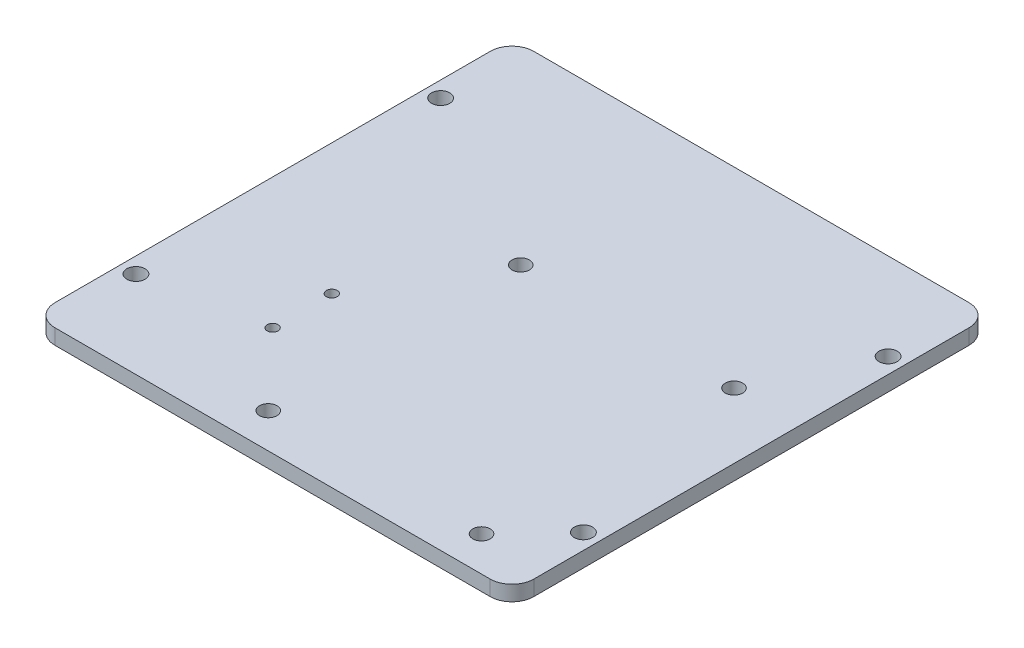
ISO-10303-21;
HEADER;
FILE_DESCRIPTION(('STEP AP214'),'2;1');
FILE_NAME('part.step','',(''),(''),'','','');
FILE_SCHEMA(('AUTOMOTIVE_DESIGN { 1 0 10303 214 1 1 1 1 }'));
ENDSEC;
DATA;
#1=APPLICATION_CONTEXT('core data for automotive mechanical design processes');
#2=APPLICATION_PROTOCOL_DEFINITION('international standard','automotive_design',2000,#1);
#3=PRODUCT_CONTEXT('',#1,'mechanical');
#4=PRODUCT('Part','Part','',(#3));
#5=PRODUCT_RELATED_PRODUCT_CATEGORY('part','',(#4));
#6=PRODUCT_DEFINITION_FORMATION('','',#4);
#7=PRODUCT_DEFINITION_CONTEXT('part definition',#1,'design');
#8=PRODUCT_DEFINITION('design','',#6,#7);
#9=PRODUCT_DEFINITION_SHAPE('','',#8);
#10=(LENGTH_UNIT() NAMED_UNIT(*) SI_UNIT(.MILLI.,.METRE.));
#11=(NAMED_UNIT(*) PLANE_ANGLE_UNIT() SI_UNIT($,.RADIAN.));
#12=(NAMED_UNIT(*) SI_UNIT($,.STERADIAN.) SOLID_ANGLE_UNIT());
#13=UNCERTAINTY_MEASURE_WITH_UNIT(LENGTH_MEASURE(1.E-05),#10,'distance_accuracy_value','');
#14=(GEOMETRIC_REPRESENTATION_CONTEXT(3) GLOBAL_UNCERTAINTY_ASSIGNED_CONTEXT((#13)) GLOBAL_UNIT_ASSIGNED_CONTEXT((#10,
#11,#12)) REPRESENTATION_CONTEXT('',''));
#15=CARTESIAN_POINT('',(0.,0.,0.));
#16=DIRECTION('',(0.,0.,1.));
#17=DIRECTION('',(1.,0.,0.));
#18=AXIS2_PLACEMENT_3D('',#15,#16,#17);
#19=CARTESIAN_POINT('',(0.,3.5,-55.));
#20=DIRECTION('',(0.,0.,-1.));
#21=DIRECTION('',(-1.,0.,0.));
#22=AXIS2_PLACEMENT_3D('',#19,#20,#21);
#23=PLANE('',#22);
#24=DIRECTION('',(1.,0.,0.));
#25=VECTOR('',#24,1.);
#26=CARTESIAN_POINT('',(0.,0.,-55.));
#27=LINE('',#26,#25);
#28=CARTESIAN_POINT('',(-50.,0.,-55.));
#29=VERTEX_POINT('',#28);
#30=CARTESIAN_POINT('',(50.,0.,-55.));
#31=VERTEX_POINT('',#30);
#32=EDGE_CURVE('E131',#29,#31,#27,.T.);
#33=ORIENTED_EDGE('',*,*,#32,.F.);
#34=DIRECTION('',(0.,-1.,0.));
#35=VECTOR('',#34,1.);
#36=CARTESIAN_POINT('',(-50.,3.5,-55.));
#37=LINE('',#36,#35);
#38=CARTESIAN_POINT('',(-50.,3.5,-55.));
#39=VERTEX_POINT('',#38);
#40=EDGE_CURVE('E153',#29,#39,#37,.F.);
#41=ORIENTED_EDGE('',*,*,#40,.T.);
#42=DIRECTION('',(1.,0.,0.));
#43=VECTOR('',#42,1.);
#44=CARTESIAN_POINT('',(0.,3.5,-55.));
#45=LINE('',#44,#43);
#46=CARTESIAN_POINT('',(50.,3.5,-55.));
#47=VERTEX_POINT('',#46);
#48=EDGE_CURVE('E172',#39,#47,#45,.T.);
#49=ORIENTED_EDGE('',*,*,#48,.T.);
#50=DIRECTION('',(0.,-1.,0.));
#51=VECTOR('',#50,1.);
#52=CARTESIAN_POINT('',(50.,0.,-55.));
#53=LINE('',#52,#51);
#54=EDGE_CURVE('E150',#47,#31,#53,.T.);
#55=ORIENTED_EDGE('',*,*,#54,.T.);
#56=EDGE_LOOP('',(#33,#41,#49,#55));
#57=FACE_BOUND('',#56,.T.);
#58=ADVANCED_FACE('F43',(#57),#23,.T.);
#59=CARTESIAN_POINT('',(-55.,3.5,0.));
#60=DIRECTION('',(-1.,0.,0.));
#61=DIRECTION('',(0.,0.,1.));
#62=AXIS2_PLACEMENT_3D('',#59,#60,#61);
#63=PLANE('',#62);
#64=DIRECTION('',(0.,0.,-1.));
#65=VECTOR('',#64,1.);
#66=CARTESIAN_POINT('',(-55.,3.5,0.));
#67=LINE('',#66,#65);
#68=CARTESIAN_POINT('',(-55.,3.5,50.));
#69=VERTEX_POINT('',#68);
#70=CARTESIAN_POINT('',(-55.,3.5,-50.));
#71=VERTEX_POINT('',#70);
#72=EDGE_CURVE('E169',#69,#71,#67,.T.);
#73=ORIENTED_EDGE('',*,*,#72,.T.);
#74=DIRECTION('',(0.,-1.,0.));
#75=VECTOR('',#74,1.);
#76=CARTESIAN_POINT('',(-55.,3.5,-50.));
#77=LINE('',#76,#75);
#78=CARTESIAN_POINT('',(-55.,0.,-50.));
#79=VERTEX_POINT('',#78);
#80=EDGE_CURVE('E130',#71,#79,#77,.T.);
#81=ORIENTED_EDGE('',*,*,#80,.T.);
#82=DIRECTION('',(0.,0.,-1.));
#83=VECTOR('',#82,1.);
#84=CARTESIAN_POINT('',(-55.,0.,0.));
#85=LINE('',#84,#83);
#86=CARTESIAN_POINT('',(-55.,0.,50.));
#87=VERTEX_POINT('',#86);
#88=EDGE_CURVE('E113',#87,#79,#85,.T.);
#89=ORIENTED_EDGE('',*,*,#88,.F.);
#90=DIRECTION('',(0.,-1.,0.));
#91=VECTOR('',#90,1.);
#92=CARTESIAN_POINT('',(-55.,3.5,50.));
#93=LINE('',#92,#91);
#94=EDGE_CURVE('E127',#87,#69,#93,.F.);
#95=ORIENTED_EDGE('',*,*,#94,.T.);
#96=EDGE_LOOP('',(#73,#81,#89,#95));
#97=FACE_BOUND('',#96,.T.);
#98=ADVANCED_FACE('F126',(#97),#63,.T.);
#99=CARTESIAN_POINT('',(0.,3.5,55.));
#100=DIRECTION('',(0.,0.,-1.));
#101=DIRECTION('',(-1.,0.,0.));
#102=AXIS2_PLACEMENT_3D('',#99,#100,#101);
#103=PLANE('',#102);
#104=DIRECTION('',(1.,0.,0.));
#105=VECTOR('',#104,1.);
#106=CARTESIAN_POINT('',(0.,3.5,55.));
#107=LINE('',#106,#105);
#108=CARTESIAN_POINT('',(-50.,3.5,55.));
#109=VERTEX_POINT('',#108);
#110=CARTESIAN_POINT('',(50.,3.5,55.));
#111=VERTEX_POINT('',#110);
#112=EDGE_CURVE('E168',#109,#111,#107,.T.);
#113=ORIENTED_EDGE('',*,*,#112,.F.);
#114=DIRECTION('',(0.,-1.,0.));
#115=VECTOR('',#114,1.);
#116=CARTESIAN_POINT('',(-50.,0.,55.));
#117=LINE('',#116,#115);
#118=CARTESIAN_POINT('',(-50.,0.,55.));
#119=VERTEX_POINT('',#118);
#120=EDGE_CURVE('E163',#109,#119,#117,.T.);
#121=ORIENTED_EDGE('',*,*,#120,.T.);
#122=DIRECTION('',(1.,0.,0.));
#123=VECTOR('',#122,1.);
#124=CARTESIAN_POINT('',(0.,0.,55.));
#125=LINE('',#124,#123);
#126=CARTESIAN_POINT('',(50.,0.,55.));
#127=VERTEX_POINT('',#126);
#128=EDGE_CURVE('E115',#119,#127,#125,.T.);
#129=ORIENTED_EDGE('',*,*,#128,.T.);
#130=DIRECTION('',(0.,-1.,0.));
#131=VECTOR('',#130,1.);
#132=CARTESIAN_POINT('',(50.,3.5,55.));
#133=LINE('',#132,#131);
#134=EDGE_CURVE('E161',#127,#111,#133,.F.);
#135=ORIENTED_EDGE('',*,*,#134,.T.);
#136=EDGE_LOOP('',(#113,#121,#129,#135));
#137=FACE_BOUND('',#136,.T.);
#138=ADVANCED_FACE('F166',(#137),#103,.F.);
#139=CARTESIAN_POINT('',(55.,3.5,0.));
#140=DIRECTION('',(-1.,0.,0.));
#141=DIRECTION('',(0.,0.,1.));
#142=AXIS2_PLACEMENT_3D('',#139,#140,#141);
#143=PLANE('',#142);
#144=DIRECTION('',(0.,0.,-1.));
#145=VECTOR('',#144,1.);
#146=CARTESIAN_POINT('',(55.,3.5,0.));
#147=LINE('',#146,#145);
#148=CARTESIAN_POINT('',(55.,3.5,50.));
#149=VERTEX_POINT('',#148);
#150=CARTESIAN_POINT('',(55.,3.5,-50.));
#151=VERTEX_POINT('',#150);
#152=EDGE_CURVE('E141',#149,#151,#147,.T.);
#153=ORIENTED_EDGE('',*,*,#152,.F.);
#154=DIRECTION('',(0.,-1.,0.));
#155=VECTOR('',#154,1.);
#156=CARTESIAN_POINT('',(55.,3.5,50.));
#157=LINE('',#156,#155);
#158=CARTESIAN_POINT('',(55.,0.,50.));
#159=VERTEX_POINT('',#158);
#160=EDGE_CURVE('E11',#149,#159,#157,.T.);
#161=ORIENTED_EDGE('',*,*,#160,.T.);
#162=DIRECTION('',(0.,0.,-1.));
#163=VECTOR('',#162,1.);
#164=CARTESIAN_POINT('',(55.,0.,0.));
#165=LINE('',#164,#163);
#166=CARTESIAN_POINT('',(55.,0.,-50.));
#167=VERTEX_POINT('',#166);
#168=EDGE_CURVE('E188',#159,#167,#165,.T.);
#169=ORIENTED_EDGE('',*,*,#168,.T.);
#170=DIRECTION('',(0.,-1.,0.));
#171=VECTOR('',#170,1.);
#172=CARTESIAN_POINT('',(55.,3.5,-50.));
#173=LINE('',#172,#171);
#174=EDGE_CURVE('E51',#167,#151,#173,.F.);
#175=ORIENTED_EDGE('',*,*,#174,.T.);
#176=EDGE_LOOP('',(#153,#161,#169,#175));
#177=FACE_BOUND('',#176,.T.);
#178=ADVANCED_FACE('F248',(#177),#143,.F.);
#179=CARTESIAN_POINT('',(51.4,3.5,-35.));
#180=DIRECTION('',(0.,-1.,0.));
#181=DIRECTION('',(0.,0.,-1.));
#182=AXIS2_PLACEMENT_3D('',#179,#180,#181);
#183=CYLINDRICAL_SURFACE('',#182,2.1);
#184=CARTESIAN_POINT('',(51.4,3.5,-35.));
#185=DIRECTION('',(0.,1.,0.));
#186=DIRECTION('',(0.,0.,1.));
#187=AXIS2_PLACEMENT_3D('',#184,#185,#186);
#188=CIRCLE('',#187,2.1);
#189=CARTESIAN_POINT('',(51.4,3.5,-32.9));
#190=VERTEX_POINT('',#189);
#191=EDGE_CURVE('E199',#190,#190,#188,.F.);
#192=ORIENTED_EDGE('',*,*,#191,.F.);
#193=EDGE_LOOP('',(#192));
#194=FACE_BOUND('',#193,.T.);
#195=CARTESIAN_POINT('',(51.4,0.,-35.));
#196=DIRECTION('',(0.,1.,0.));
#197=DIRECTION('',(0.,0.,1.));
#198=AXIS2_PLACEMENT_3D('',#195,#196,#197);
#199=CIRCLE('',#198,2.1);
#200=CARTESIAN_POINT('',(51.4,0.,-32.9));
#201=VERTEX_POINT('',#200);
#202=EDGE_CURVE('E183',#201,#201,#199,.F.);
#203=ORIENTED_EDGE('',*,*,#202,.T.);
#204=EDGE_LOOP('',(#203));
#205=FACE_BOUND('',#204,.T.);
#206=ADVANCED_FACE('F245',(#194,#205),#183,.F.);
#207=CARTESIAN_POINT('',(51.4,3.5,35.));
#208=DIRECTION('',(0.,-1.,0.));
#209=DIRECTION('',(0.,0.,-1.));
#210=AXIS2_PLACEMENT_3D('',#207,#208,#209);
#211=CYLINDRICAL_SURFACE('',#210,2.1);
#212=CARTESIAN_POINT('',(51.4,3.5,35.));
#213=DIRECTION('',(0.,1.,0.));
#214=DIRECTION('',(0.,0.,1.));
#215=AXIS2_PLACEMENT_3D('',#212,#213,#214);
#216=CIRCLE('',#215,2.1);
#217=CARTESIAN_POINT('',(51.4,3.5,37.1));
#218=VERTEX_POINT('',#217);
#219=EDGE_CURVE('E194',#218,#218,#216,.T.);
#220=ORIENTED_EDGE('',*,*,#219,.T.);
#221=EDGE_LOOP('',(#220));
#222=FACE_BOUND('',#221,.T.);
#223=CARTESIAN_POINT('',(51.4,0.,35.));
#224=DIRECTION('',(0.,1.,0.));
#225=DIRECTION('',(0.,0.,1.));
#226=AXIS2_PLACEMENT_3D('',#223,#224,#225);
#227=CIRCLE('',#226,2.1);
#228=CARTESIAN_POINT('',(51.4,0.,37.1));
#229=VERTEX_POINT('',#228);
#230=EDGE_CURVE('E179',#229,#229,#227,.T.);
#231=ORIENTED_EDGE('',*,*,#230,.F.);
#232=EDGE_LOOP('',(#231));
#233=FACE_BOUND('',#232,.T.);
#234=ADVANCED_FACE('F232',(#222,#233),#211,.F.);
#235=CARTESIAN_POINT('',(-51.4,3.5,35.));
#236=DIRECTION('',(0.,-1.,0.));
#237=DIRECTION('',(0.,0.,-1.));
#238=AXIS2_PLACEMENT_3D('',#235,#236,#237);
#239=CYLINDRICAL_SURFACE('',#238,2.1);
#240=CARTESIAN_POINT('',(-51.4,3.5,35.));
#241=DIRECTION('',(0.,1.,0.));
#242=DIRECTION('',(0.,0.,1.));
#243=AXIS2_PLACEMENT_3D('',#240,#241,#242);
#244=CIRCLE('',#243,2.1);
#245=CARTESIAN_POINT('',(-51.4,3.5,37.1));
#246=VERTEX_POINT('',#245);
#247=EDGE_CURVE('E191',#246,#246,#244,.F.);
#248=ORIENTED_EDGE('',*,*,#247,.F.);
#249=EDGE_LOOP('',(#248));
#250=FACE_BOUND('',#249,.T.);
#251=CARTESIAN_POINT('',(-51.4,0.,35.));
#252=DIRECTION('',(0.,1.,0.));
#253=DIRECTION('',(0.,0.,1.));
#254=AXIS2_PLACEMENT_3D('',#251,#252,#253);
#255=CIRCLE('',#254,2.1);
#256=CARTESIAN_POINT('',(-51.4,0.,37.1));
#257=VERTEX_POINT('',#256);
#258=EDGE_CURVE('E176',#257,#257,#255,.F.);
#259=ORIENTED_EDGE('',*,*,#258,.T.);
#260=EDGE_LOOP('',(#259));
#261=FACE_BOUND('',#260,.T.);
#262=ADVANCED_FACE('F227',(#250,#261),#239,.F.);
#263=CARTESIAN_POINT('',(-51.4,3.5,-35.));
#264=DIRECTION('',(0.,-1.,0.));
#265=DIRECTION('',(0.,0.,-1.));
#266=AXIS2_PLACEMENT_3D('',#263,#264,#265);
#267=CYLINDRICAL_SURFACE('',#266,2.1);
#268=CARTESIAN_POINT('',(-51.4,3.5,-35.));
#269=DIRECTION('',(0.,1.,0.));
#270=DIRECTION('',(0.,0.,1.));
#271=AXIS2_PLACEMENT_3D('',#268,#269,#270);
#272=CIRCLE('',#271,2.1);
#273=CARTESIAN_POINT('',(-51.4,3.5,-32.9));
#274=VERTEX_POINT('',#273);
#275=EDGE_CURVE('E136',#274,#274,#272,.T.);
#276=ORIENTED_EDGE('',*,*,#275,.T.);
#277=EDGE_LOOP('',(#276));
#278=FACE_BOUND('',#277,.T.);
#279=CARTESIAN_POINT('',(-51.4,0.,-35.));
#280=DIRECTION('',(0.,1.,0.));
#281=DIRECTION('',(0.,0.,1.));
#282=AXIS2_PLACEMENT_3D('',#279,#280,#281);
#283=CIRCLE('',#282,2.1);
#284=CARTESIAN_POINT('',(-51.4,0.,-32.9));
#285=VERTEX_POINT('',#284);
#286=EDGE_CURVE('E144',#285,#285,#283,.T.);
#287=ORIENTED_EDGE('',*,*,#286,.F.);
#288=EDGE_LOOP('',(#287));
#289=FACE_BOUND('',#288,.T.);
#290=ADVANCED_FACE('F220',(#278,#289),#267,.F.);
#291=CARTESIAN_POINT('',(0.,3.5,0.));
#292=DIRECTION('',(0.,1.,0.));
#293=DIRECTION('',(0.,0.,1.));
#294=AXIS2_PLACEMENT_3D('',#291,#292,#293);
#295=PLANE('',#294);
#296=CARTESIAN_POINT('',(-25.,3.5,30.));
#297=DIRECTION('',(0.,-1.,0.));
#298=DIRECTION('',(0.,0.,-1.));
#299=AXIS2_PLACEMENT_3D('',#296,#297,#298);
#300=CIRCLE('',#299,1.25);
#301=CARTESIAN_POINT('',(-25.,3.5,28.75));
#302=VERTEX_POINT('',#301);
#303=EDGE_CURVE('E457',#302,#302,#300,.T.);
#304=ORIENTED_EDGE('',*,*,#303,.T.);
#305=EDGE_LOOP('',(#304));
#306=FACE_BOUND('',#305,.T.);
#307=CARTESIAN_POINT('',(-25.,3.5,16.4));
#308=DIRECTION('',(0.,-1.,0.));
#309=DIRECTION('',(0.,0.,-1.));
#310=AXIS2_PLACEMENT_3D('',#307,#308,#309);
#311=CIRCLE('',#310,1.25);
#312=CARTESIAN_POINT('',(-25.,3.5,15.15));
#313=VERTEX_POINT('',#312);
#314=EDGE_CURVE('E466',#313,#313,#311,.T.);
#315=ORIENTED_EDGE('',*,*,#314,.T.);
#316=EDGE_LOOP('',(#315));
#317=FACE_BOUND('',#316,.T.);
#318=CARTESIAN_POINT('',(-9.,3.5,-11.));
#319=DIRECTION('',(0.,1.,0.));
#320=DIRECTION('',(0.,0.,1.));
#321=AXIS2_PLACEMENT_3D('',#318,#319,#320);
#322=CIRCLE('',#321,2.);
#323=CARTESIAN_POINT('',(-9.,3.5,-9.00000000000001));
#324=VERTEX_POINT('',#323);
#325=EDGE_CURVE('E483',#324,#324,#322,.T.);
#326=ORIENTED_EDGE('',*,*,#325,.F.);
#327=EDGE_LOOP('',(#326));
#328=FACE_BOUND('',#327,.T.);
#329=CARTESIAN_POINT('',(-9.,3.5,47.));
#330=DIRECTION('',(0.,1.,0.));
#331=DIRECTION('',(0.,0.,1.));
#332=AXIS2_PLACEMENT_3D('',#329,#330,#331);
#333=CIRCLE('',#332,2.);
#334=CARTESIAN_POINT('',(-9.,3.5,49.));
#335=VERTEX_POINT('',#334);
#336=EDGE_CURVE('E477',#335,#335,#333,.T.);
#337=ORIENTED_EDGE('',*,*,#336,.F.);
#338=EDGE_LOOP('',(#337));
#339=FACE_BOUND('',#338,.T.);
#340=CARTESIAN_POINT('',(40.,3.5,47.));
#341=DIRECTION('',(0.,1.,0.));
#342=DIRECTION('',(0.,0.,1.));
#343=AXIS2_PLACEMENT_3D('',#340,#341,#342);
#344=CIRCLE('',#343,2.);
#345=CARTESIAN_POINT('',(40.,3.5,49.));
#346=VERTEX_POINT('',#345);
#347=EDGE_CURVE('E471',#346,#346,#344,.T.);
#348=ORIENTED_EDGE('',*,*,#347,.F.);
#349=EDGE_LOOP('',(#348));
#350=FACE_BOUND('',#349,.T.);
#351=CARTESIAN_POINT('',(40.,3.5,-11.));
#352=DIRECTION('',(0.,1.,0.));
#353=DIRECTION('',(0.,0.,1.));
#354=AXIS2_PLACEMENT_3D('',#351,#352,#353);
#355=CIRCLE('',#354,2.);
#356=CARTESIAN_POINT('',(40.,3.5,-9.00000000000001));
#357=VERTEX_POINT('',#356);
#358=EDGE_CURVE('E202',#357,#357,#355,.T.);
#359=ORIENTED_EDGE('',*,*,#358,.F.);
#360=EDGE_LOOP('',(#359));
#361=FACE_BOUND('',#360,.T.);
#362=ORIENTED_EDGE('',*,*,#247,.T.);
#363=EDGE_LOOP('',(#362));
#364=FACE_BOUND('',#363,.T.);
#365=ORIENTED_EDGE('',*,*,#219,.F.);
#366=EDGE_LOOP('',(#365));
#367=FACE_BOUND('',#366,.T.);
#368=ORIENTED_EDGE('',*,*,#191,.T.);
#369=EDGE_LOOP('',(#368));
#370=FACE_BOUND('',#369,.T.);
#371=ORIENTED_EDGE('',*,*,#48,.F.);
#372=CARTESIAN_POINT('',(-50.,3.5,-50.));
#373=DIRECTION('',(0.,1.,0.));
#374=DIRECTION('',(0.,0.,1.));
#375=AXIS2_PLACEMENT_3D('',#372,#373,#374);
#376=CIRCLE('',#375,5.);
#377=EDGE_CURVE('E159',#39,#71,#376,.T.);
#378=ORIENTED_EDGE('',*,*,#377,.T.);
#379=ORIENTED_EDGE('',*,*,#72,.F.);
#380=CARTESIAN_POINT('',(-50.,3.5,50.));
#381=DIRECTION('',(0.,1.,0.));
#382=DIRECTION('',(0.,0.,1.));
#383=AXIS2_PLACEMENT_3D('',#380,#381,#382);
#384=CIRCLE('',#383,5.);
#385=EDGE_CURVE('E135',#69,#109,#384,.T.);
#386=ORIENTED_EDGE('',*,*,#385,.T.);
#387=ORIENTED_EDGE('',*,*,#112,.T.);
#388=CARTESIAN_POINT('',(50.,3.5,50.));
#389=DIRECTION('',(0.,1.,0.));
#390=DIRECTION('',(0.,0.,1.));
#391=AXIS2_PLACEMENT_3D('',#388,#389,#390);
#392=CIRCLE('',#391,5.);
#393=EDGE_CURVE('E64',#111,#149,#392,.T.);
#394=ORIENTED_EDGE('',*,*,#393,.T.);
#395=ORIENTED_EDGE('',*,*,#152,.T.);
#396=CARTESIAN_POINT('',(50.,3.5,-50.));
#397=DIRECTION('',(0.,1.,0.));
#398=DIRECTION('',(0.,0.,1.));
#399=AXIS2_PLACEMENT_3D('',#396,#397,#398);
#400=CIRCLE('',#399,5.);
#401=EDGE_CURVE('E155',#151,#47,#400,.T.);
#402=ORIENTED_EDGE('',*,*,#401,.T.);
#403=EDGE_LOOP('',(#371,#378,#379,#386,#387,#394,#395,#402));
#404=FACE_BOUND('',#403,.T.);
#405=ORIENTED_EDGE('',*,*,#275,.F.);
#406=EDGE_LOOP('',(#405));
#407=FACE_BOUND('',#406,.T.);
#408=ADVANCED_FACE('F217',(#306,#317,#328,#339,#350,#361,#364,#367,#370,#404,#407),#295,.T.);
#409=CARTESIAN_POINT('',(0.,0.,0.));
#410=DIRECTION('',(0.,1.,0.));
#411=DIRECTION('',(0.,0.,1.));
#412=AXIS2_PLACEMENT_3D('',#409,#410,#411);
#413=PLANE('',#412);
#414=CARTESIAN_POINT('',(-25.,0.,30.));
#415=DIRECTION('',(0.,-1.,0.));
#416=DIRECTION('',(0.,0.,-1.));
#417=AXIS2_PLACEMENT_3D('',#414,#415,#416);
#418=CIRCLE('',#417,1.25);
#419=CARTESIAN_POINT('',(-25.,0.,28.75));
#420=VERTEX_POINT('',#419);
#421=EDGE_CURVE('E460',#420,#420,#418,.T.);
#422=ORIENTED_EDGE('',*,*,#421,.F.);
#423=EDGE_LOOP('',(#422));
#424=FACE_BOUND('',#423,.T.);
#425=CARTESIAN_POINT('',(-25.,0.,16.4));
#426=DIRECTION('',(0.,-1.,0.));
#427=DIRECTION('',(0.,0.,-1.));
#428=AXIS2_PLACEMENT_3D('',#425,#426,#427);
#429=CIRCLE('',#428,1.25);
#430=CARTESIAN_POINT('',(-25.,0.,15.15));
#431=VERTEX_POINT('',#430);
#432=EDGE_CURVE('E461',#431,#431,#429,.T.);
#433=ORIENTED_EDGE('',*,*,#432,.F.);
#434=EDGE_LOOP('',(#433));
#435=FACE_BOUND('',#434,.T.);
#436=CARTESIAN_POINT('',(-9.,0.,-11.));
#437=DIRECTION('',(0.,1.,0.));
#438=DIRECTION('',(0.,0.,1.));
#439=AXIS2_PLACEMENT_3D('',#436,#437,#438);
#440=CIRCLE('',#439,2.);
#441=CARTESIAN_POINT('',(-9.,0.,-9.00000000000001));
#442=VERTEX_POINT('',#441);
#443=EDGE_CURVE('E463',#442,#442,#440,.T.);
#444=ORIENTED_EDGE('',*,*,#443,.T.);
#445=EDGE_LOOP('',(#444));
#446=FACE_BOUND('',#445,.T.);
#447=CARTESIAN_POINT('',(-9.,0.,47.));
#448=DIRECTION('',(0.,1.,0.));
#449=DIRECTION('',(0.,0.,1.));
#450=AXIS2_PLACEMENT_3D('',#447,#448,#449);
#451=CIRCLE('',#450,2.);
#452=CARTESIAN_POINT('',(-9.,0.,49.));
#453=VERTEX_POINT('',#452);
#454=EDGE_CURVE('E480',#453,#453,#451,.T.);
#455=ORIENTED_EDGE('',*,*,#454,.T.);
#456=EDGE_LOOP('',(#455));
#457=FACE_BOUND('',#456,.T.);
#458=CARTESIAN_POINT('',(40.,0.,47.));
#459=DIRECTION('',(0.,1.,0.));
#460=DIRECTION('',(0.,0.,1.));
#461=AXIS2_PLACEMENT_3D('',#458,#459,#460);
#462=CIRCLE('',#461,2.);
#463=CARTESIAN_POINT('',(40.,0.,49.));
#464=VERTEX_POINT('',#463);
#465=EDGE_CURVE('E474',#464,#464,#462,.T.);
#466=ORIENTED_EDGE('',*,*,#465,.T.);
#467=EDGE_LOOP('',(#466));
#468=FACE_BOUND('',#467,.T.);
#469=CARTESIAN_POINT('',(40.,0.,-11.));
#470=DIRECTION('',(0.,1.,0.));
#471=DIRECTION('',(0.,0.,1.));
#472=AXIS2_PLACEMENT_3D('',#469,#470,#471);
#473=CIRCLE('',#472,2.);
#474=CARTESIAN_POINT('',(40.,0.,-9.00000000000001));
#475=VERTEX_POINT('',#474);
#476=EDGE_CURVE('E180',#475,#475,#473,.T.);
#477=ORIENTED_EDGE('',*,*,#476,.T.);
#478=EDGE_LOOP('',(#477));
#479=FACE_BOUND('',#478,.T.);
#480=ORIENTED_EDGE('',*,*,#258,.F.);
#481=EDGE_LOOP('',(#480));
#482=FACE_BOUND('',#481,.T.);
#483=ORIENTED_EDGE('',*,*,#230,.T.);
#484=EDGE_LOOP('',(#483));
#485=FACE_BOUND('',#484,.T.);
#486=ORIENTED_EDGE('',*,*,#202,.F.);
#487=EDGE_LOOP('',(#486));
#488=FACE_BOUND('',#487,.T.);
#489=ORIENTED_EDGE('',*,*,#88,.T.);
#490=CARTESIAN_POINT('',(-50.,0.,-50.));
#491=DIRECTION('',(0.,1.,0.));
#492=DIRECTION('',(0.,0.,1.));
#493=AXIS2_PLACEMENT_3D('',#490,#491,#492);
#494=CIRCLE('',#493,5.);
#495=EDGE_CURVE('E120',#79,#29,#494,.F.);
#496=ORIENTED_EDGE('',*,*,#495,.T.);
#497=ORIENTED_EDGE('',*,*,#32,.T.);
#498=CARTESIAN_POINT('',(50.,0.,-50.));
#499=DIRECTION('',(0.,1.,0.));
#500=DIRECTION('',(0.,0.,1.));
#501=AXIS2_PLACEMENT_3D('',#498,#499,#500);
#502=CIRCLE('',#501,5.);
#503=EDGE_CURVE('E138',#31,#167,#502,.F.);
#504=ORIENTED_EDGE('',*,*,#503,.T.);
#505=ORIENTED_EDGE('',*,*,#168,.F.);
#506=CARTESIAN_POINT('',(50.,0.,50.));
#507=DIRECTION('',(0.,1.,0.));
#508=DIRECTION('',(0.,0.,1.));
#509=AXIS2_PLACEMENT_3D('',#506,#507,#508);
#510=CIRCLE('',#509,5.);
#511=EDGE_CURVE('E121',#159,#127,#510,.F.);
#512=ORIENTED_EDGE('',*,*,#511,.T.);
#513=ORIENTED_EDGE('',*,*,#128,.F.);
#514=CARTESIAN_POINT('',(-50.,0.,50.));
#515=DIRECTION('',(0.,1.,0.));
#516=DIRECTION('',(0.,0.,1.));
#517=AXIS2_PLACEMENT_3D('',#514,#515,#516);
#518=CIRCLE('',#517,5.);
#519=EDGE_CURVE('E109',#119,#87,#518,.F.);
#520=ORIENTED_EDGE('',*,*,#519,.T.);
#521=EDGE_LOOP('',(#489,#496,#497,#504,#505,#512,#513,#520));
#522=FACE_BOUND('',#521,.T.);
#523=ORIENTED_EDGE('',*,*,#286,.T.);
#524=EDGE_LOOP('',(#523));
#525=FACE_BOUND('',#524,.T.);
#526=ADVANCED_FACE('F111',(#424,#435,#446,#457,#468,#479,#482,#485,#488,#522,#525),#413,.F.);
#527=CARTESIAN_POINT('',(-50.,3.5,-50.));
#528=DIRECTION('',(0.,-1.,0.));
#529=DIRECTION('',(0.,0.,-1.));
#530=AXIS2_PLACEMENT_3D('',#527,#528,#529);
#531=CYLINDRICAL_SURFACE('',#530,5.);
#532=ORIENTED_EDGE('',*,*,#377,.F.);
#533=ORIENTED_EDGE('',*,*,#40,.F.);
#534=ORIENTED_EDGE('',*,*,#495,.F.);
#535=ORIENTED_EDGE('',*,*,#80,.F.);
#536=EDGE_LOOP('',(#532,#533,#534,#535));
#537=FACE_BOUND('',#536,.T.);
#538=ADVANCED_FACE('F216',(#537),#531,.T.);
#539=CARTESIAN_POINT('',(-50.,3.5,50.));
#540=DIRECTION('',(0.,1.,0.));
#541=DIRECTION('',(0.,0.,1.));
#542=AXIS2_PLACEMENT_3D('',#539,#540,#541);
#543=CYLINDRICAL_SURFACE('',#542,5.);
#544=ORIENTED_EDGE('',*,*,#385,.F.);
#545=ORIENTED_EDGE('',*,*,#94,.F.);
#546=ORIENTED_EDGE('',*,*,#519,.F.);
#547=ORIENTED_EDGE('',*,*,#120,.F.);
#548=EDGE_LOOP('',(#544,#545,#546,#547));
#549=FACE_BOUND('',#548,.T.);
#550=ADVANCED_FACE('F134',(#549),#543,.T.);
#551=CARTESIAN_POINT('',(50.,3.5,50.));
#552=DIRECTION('',(0.,-1.,0.));
#553=DIRECTION('',(0.,0.,-1.));
#554=AXIS2_PLACEMENT_3D('',#551,#552,#553);
#555=CYLINDRICAL_SURFACE('',#554,5.);
#556=ORIENTED_EDGE('',*,*,#393,.F.);
#557=ORIENTED_EDGE('',*,*,#134,.F.);
#558=ORIENTED_EDGE('',*,*,#511,.F.);
#559=ORIENTED_EDGE('',*,*,#160,.F.);
#560=EDGE_LOOP('',(#556,#557,#558,#559));
#561=FACE_BOUND('',#560,.T.);
#562=ADVANCED_FACE('F256',(#561),#555,.T.);
#563=CARTESIAN_POINT('',(50.,3.5,-50.));
#564=DIRECTION('',(0.,1.,0.));
#565=DIRECTION('',(0.,0.,1.));
#566=AXIS2_PLACEMENT_3D('',#563,#564,#565);
#567=CYLINDRICAL_SURFACE('',#566,5.);
#568=ORIENTED_EDGE('',*,*,#401,.F.);
#569=ORIENTED_EDGE('',*,*,#174,.F.);
#570=ORIENTED_EDGE('',*,*,#503,.F.);
#571=ORIENTED_EDGE('',*,*,#54,.F.);
#572=EDGE_LOOP('',(#568,#569,#570,#571));
#573=FACE_BOUND('',#572,.T.);
#574=ADVANCED_FACE('F45',(#573),#567,.T.);
#575=CARTESIAN_POINT('',(40.,0.,-11.));
#576=DIRECTION('',(0.,1.,0.));
#577=DIRECTION('',(0.,0.,1.));
#578=AXIS2_PLACEMENT_3D('',#575,#576,#577);
#579=CYLINDRICAL_SURFACE('',#578,2.);
#580=ORIENTED_EDGE('',*,*,#476,.F.);
#581=EDGE_LOOP('',(#580));
#582=FACE_BOUND('',#581,.T.);
#583=ORIENTED_EDGE('',*,*,#358,.T.);
#584=EDGE_LOOP('',(#583));
#585=FACE_BOUND('',#584,.T.);
#586=ADVANCED_FACE('F262',(#582,#585),#579,.F.);
#587=CARTESIAN_POINT('',(40.,0.,47.));
#588=DIRECTION('',(0.,1.,0.));
#589=DIRECTION('',(0.,0.,1.));
#590=AXIS2_PLACEMENT_3D('',#587,#588,#589);
#591=CYLINDRICAL_SURFACE('',#590,2.);
#592=ORIENTED_EDGE('',*,*,#465,.F.);
#593=EDGE_LOOP('',(#592));
#594=FACE_BOUND('',#593,.T.);
#595=ORIENTED_EDGE('',*,*,#347,.T.);
#596=EDGE_LOOP('',(#595));
#597=FACE_BOUND('',#596,.T.);
#598=ADVANCED_FACE('F360',(#594,#597),#591,.F.);
#599=CARTESIAN_POINT('',(-9.,0.,47.));
#600=DIRECTION('',(0.,1.,0.));
#601=DIRECTION('',(0.,0.,1.));
#602=AXIS2_PLACEMENT_3D('',#599,#600,#601);
#603=CYLINDRICAL_SURFACE('',#602,2.);
#604=ORIENTED_EDGE('',*,*,#454,.F.);
#605=EDGE_LOOP('',(#604));
#606=FACE_BOUND('',#605,.T.);
#607=ORIENTED_EDGE('',*,*,#336,.T.);
#608=EDGE_LOOP('',(#607));
#609=FACE_BOUND('',#608,.T.);
#610=ADVANCED_FACE('F371',(#606,#609),#603,.F.);
#611=CARTESIAN_POINT('',(-9.,0.,-11.));
#612=DIRECTION('',(0.,1.,0.));
#613=DIRECTION('',(0.,0.,1.));
#614=AXIS2_PLACEMENT_3D('',#611,#612,#613);
#615=CYLINDRICAL_SURFACE('',#614,2.);
#616=ORIENTED_EDGE('',*,*,#443,.F.);
#617=EDGE_LOOP('',(#616));
#618=FACE_BOUND('',#617,.T.);
#619=ORIENTED_EDGE('',*,*,#325,.T.);
#620=EDGE_LOOP('',(#619));
#621=FACE_BOUND('',#620,.T.);
#622=ADVANCED_FACE('F382',(#618,#621),#615,.F.);
#623=CARTESIAN_POINT('',(-25.,3.5,16.4));
#624=DIRECTION('',(0.,-1.,0.));
#625=DIRECTION('',(0.,0.,-1.));
#626=AXIS2_PLACEMENT_3D('',#623,#624,#625);
#627=CYLINDRICAL_SURFACE('',#626,1.25);
#628=ORIENTED_EDGE('',*,*,#314,.F.);
#629=EDGE_LOOP('',(#628));
#630=FACE_BOUND('',#629,.T.);
#631=ORIENTED_EDGE('',*,*,#432,.T.);
#632=EDGE_LOOP('',(#631));
#633=FACE_BOUND('',#632,.T.);
#634=ADVANCED_FACE('F393',(#630,#633),#627,.F.);
#635=CARTESIAN_POINT('',(-25.,3.5,30.));
#636=DIRECTION('',(0.,-1.,0.));
#637=DIRECTION('',(0.,0.,-1.));
#638=AXIS2_PLACEMENT_3D('',#635,#636,#637);
#639=CYLINDRICAL_SURFACE('',#638,1.25);
#640=ORIENTED_EDGE('',*,*,#303,.F.);
#641=EDGE_LOOP('',(#640));
#642=FACE_BOUND('',#641,.T.);
#643=ORIENTED_EDGE('',*,*,#421,.T.);
#644=EDGE_LOOP('',(#643));
#645=FACE_BOUND('',#644,.T.);
#646=ADVANCED_FACE('F417',(#642,#645),#639,.F.);
#647=CLOSED_SHELL('',(#58,#98,#138,#178,#206,#234,#262,#290,#408,#526,#538,#550,#562,#574,#586,
#598,#610,#622,#634,#646));
#648=MANIFOLD_SOLID_BREP('B2',#647);
#649=ADVANCED_BREP_SHAPE_REPRESENTATION('',(#18,#648),#14);
#650=SHAPE_DEFINITION_REPRESENTATION(#9,#649);
ENDSEC;
END-ISO-10303-21;
